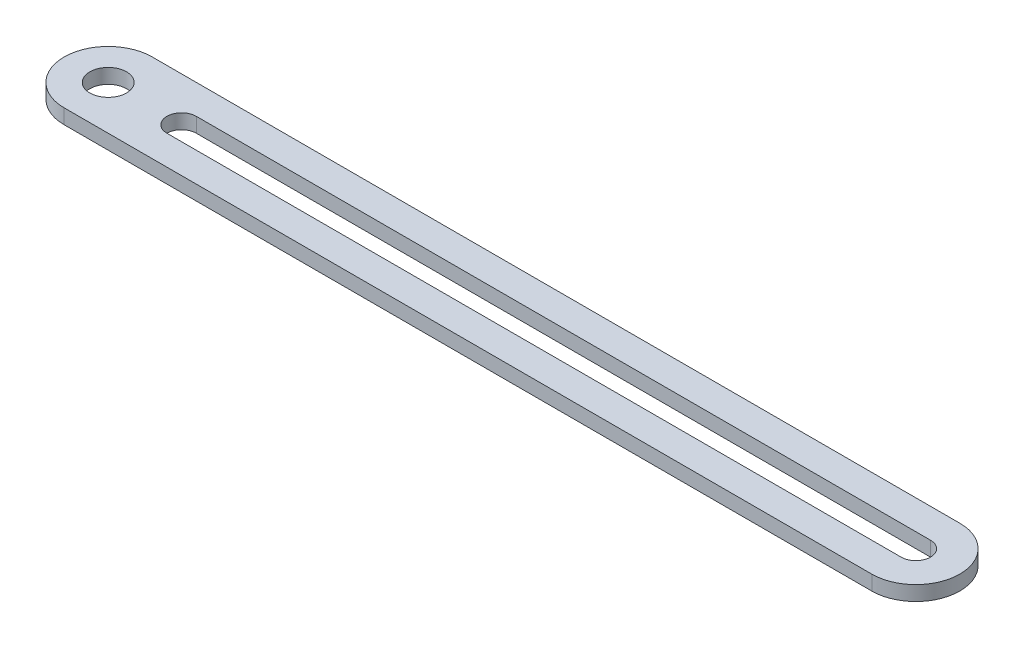
ISO-10303-21;
HEADER;
FILE_DESCRIPTION(('STEP AP214'),'2;1');
FILE_NAME('part.step','',(''),(''),'','','');
FILE_SCHEMA(('AUTOMOTIVE_DESIGN { 1 0 10303 214 1 1 1 1 }'));
ENDSEC;
DATA;
#1=APPLICATION_CONTEXT('core data for automotive mechanical design processes');
#2=APPLICATION_PROTOCOL_DEFINITION('international standard','automotive_design',2000,#1);
#3=PRODUCT_CONTEXT('',#1,'mechanical');
#4=PRODUCT('Part','Part','',(#3));
#5=PRODUCT_RELATED_PRODUCT_CATEGORY('part','',(#4));
#6=PRODUCT_DEFINITION_FORMATION('','',#4);
#7=PRODUCT_DEFINITION_CONTEXT('part definition',#1,'design');
#8=PRODUCT_DEFINITION('design','',#6,#7);
#9=PRODUCT_DEFINITION_SHAPE('','',#8);
#10=(LENGTH_UNIT() NAMED_UNIT(*) SI_UNIT(.MILLI.,.METRE.));
#11=(NAMED_UNIT(*) PLANE_ANGLE_UNIT() SI_UNIT($,.RADIAN.));
#12=(NAMED_UNIT(*) SI_UNIT($,.STERADIAN.) SOLID_ANGLE_UNIT());
#13=UNCERTAINTY_MEASURE_WITH_UNIT(LENGTH_MEASURE(1.E-05),#10,'distance_accuracy_value','');
#14=(GEOMETRIC_REPRESENTATION_CONTEXT(3) GLOBAL_UNCERTAINTY_ASSIGNED_CONTEXT((#13)) GLOBAL_UNIT_ASSIGNED_CONTEXT((#10,
#11,#12)) REPRESENTATION_CONTEXT('',''));
#15=CARTESIAN_POINT('',(0.,0.,0.));
#16=DIRECTION('',(0.,0.,1.));
#17=DIRECTION('',(1.,0.,0.));
#18=AXIS2_PLACEMENT_3D('',#15,#16,#17);
#19=CARTESIAN_POINT('',(0.,2.,0.));
#20=DIRECTION('',(0.,1.,0.));
#21=DIRECTION('',(0.,0.,1.));
#22=AXIS2_PLACEMENT_3D('',#19,#20,#21);
#23=PLANE('',#22);
#24=CARTESIAN_POINT('',(0.,2.,0.));
#25=DIRECTION('',(0.,1.,0.));
#26=DIRECTION('',(0.,0.,1.));
#27=AXIS2_PLACEMENT_3D('',#24,#25,#26);
#28=CIRCLE('',#27,6.);
#29=CARTESIAN_POINT('',(0.,2.,-6.));
#30=VERTEX_POINT('',#29);
#31=CARTESIAN_POINT('',(0.,2.,6.));
#32=VERTEX_POINT('',#31);
#33=EDGE_CURVE('E140',#30,#32,#28,.T.);
#34=ORIENTED_EDGE('',*,*,#33,.T.);
#35=DIRECTION('',(1.,0.,0.));
#36=VECTOR('',#35,1.);
#37=CARTESIAN_POINT('',(0.,2.,6.));
#38=LINE('',#37,#36);
#39=CARTESIAN_POINT('',(110.,2.,6.));
#40=VERTEX_POINT('',#39);
#41=EDGE_CURVE('E143',#32,#40,#38,.T.);
#42=ORIENTED_EDGE('',*,*,#41,.T.);
#43=CARTESIAN_POINT('',(110.,2.,0.));
#44=DIRECTION('',(0.,1.,0.));
#45=DIRECTION('',(0.,0.,1.));
#46=AXIS2_PLACEMENT_3D('',#43,#44,#45);
#47=CIRCLE('',#46,6.);
#48=CARTESIAN_POINT('',(110.,2.,-6.));
#49=VERTEX_POINT('',#48);
#50=EDGE_CURVE('E146',#40,#49,#47,.T.);
#51=ORIENTED_EDGE('',*,*,#50,.T.);
#52=DIRECTION('',(-1.,0.,0.));
#53=VECTOR('',#52,1.);
#54=CARTESIAN_POINT('',(0.,2.,-6.));
#55=LINE('',#54,#53);
#56=EDGE_CURVE('E148',#49,#30,#55,.T.);
#57=ORIENTED_EDGE('',*,*,#56,.T.);
#58=EDGE_LOOP('',(#34,#42,#51,#57));
#59=FACE_BOUND('',#58,.T.);
#60=CARTESIAN_POINT('',(0.,2.,0.));
#61=DIRECTION('',(0.,1.,0.));
#62=DIRECTION('',(0.,0.,1.));
#63=AXIS2_PLACEMENT_3D('',#60,#61,#62);
#64=CIRCLE('',#63,2.5);
#65=CARTESIAN_POINT('',(0.,2.,2.5));
#66=VERTEX_POINT('',#65);
#67=EDGE_CURVE('E134',#66,#66,#64,.T.);
#68=ORIENTED_EDGE('',*,*,#67,.F.);
#69=EDGE_LOOP('',(#68));
#70=FACE_BOUND('',#69,.T.);
#71=DIRECTION('',(1.,0.,0.));
#72=VECTOR('',#71,1.);
#73=CARTESIAN_POINT('',(10.,2.,2.));
#74=LINE('',#73,#72);
#75=CARTESIAN_POINT('',(10.,2.,2.));
#76=VERTEX_POINT('',#75);
#77=CARTESIAN_POINT('',(110.,2.,2.));
#78=VERTEX_POINT('',#77);
#79=EDGE_CURVE('E106',#76,#78,#74,.T.);
#80=ORIENTED_EDGE('',*,*,#79,.F.);
#81=CARTESIAN_POINT('',(10.,2.,0.));
#82=DIRECTION('',(0.,1.,0.));
#83=DIRECTION('',(0.,0.,1.));
#84=AXIS2_PLACEMENT_3D('',#81,#82,#83);
#85=CIRCLE('',#84,2.);
#86=CARTESIAN_POINT('',(10.,2.,-2.));
#87=VERTEX_POINT('',#86);
#88=EDGE_CURVE('E98',#87,#76,#85,.T.);
#89=ORIENTED_EDGE('',*,*,#88,.F.);
#90=DIRECTION('',(-1.,0.,0.));
#91=VECTOR('',#90,1.);
#92=CARTESIAN_POINT('',(10.,2.,-2.));
#93=LINE('',#92,#91);
#94=CARTESIAN_POINT('',(110.,2.,-2.));
#95=VERTEX_POINT('',#94);
#96=EDGE_CURVE('E120',#95,#87,#93,.T.);
#97=ORIENTED_EDGE('',*,*,#96,.F.);
#98=CARTESIAN_POINT('',(110.,2.,0.));
#99=DIRECTION('',(0.,1.,0.));
#100=DIRECTION('',(0.,0.,1.));
#101=AXIS2_PLACEMENT_3D('',#98,#99,#100);
#102=CIRCLE('',#101,2.);
#103=EDGE_CURVE('E118',#78,#95,#102,.T.);
#104=ORIENTED_EDGE('',*,*,#103,.F.);
#105=EDGE_LOOP('',(#80,#89,#97,#104));
#106=FACE_BOUND('',#105,.T.);
#107=ADVANCED_FACE('F33',(#59,#70,#106),#23,.T.);
#108=CARTESIAN_POINT('',(0.,0.,0.));
#109=DIRECTION('',(0.,1.,0.));
#110=DIRECTION('',(0.,0.,1.));
#111=AXIS2_PLACEMENT_3D('',#108,#109,#110);
#112=PLANE('',#111);
#113=CARTESIAN_POINT('',(0.,0.,0.));
#114=DIRECTION('',(0.,1.,0.));
#115=DIRECTION('',(0.,0.,1.));
#116=AXIS2_PLACEMENT_3D('',#113,#114,#115);
#117=CIRCLE('',#116,2.5);
#118=CARTESIAN_POINT('',(0.,0.,2.5));
#119=VERTEX_POINT('',#118);
#120=EDGE_CURVE('E114',#119,#119,#117,.T.);
#121=ORIENTED_EDGE('',*,*,#120,.T.);
#122=EDGE_LOOP('',(#121));
#123=FACE_BOUND('',#122,.T.);
#124=CARTESIAN_POINT('',(0.,0.,0.));
#125=DIRECTION('',(0.,1.,0.));
#126=DIRECTION('',(0.,0.,1.));
#127=AXIS2_PLACEMENT_3D('',#124,#125,#126);
#128=CIRCLE('',#127,6.);
#129=CARTESIAN_POINT('',(0.,0.,-6.));
#130=VERTEX_POINT('',#129);
#131=CARTESIAN_POINT('',(0.,0.,6.));
#132=VERTEX_POINT('',#131);
#133=EDGE_CURVE('E137',#130,#132,#128,.T.);
#134=ORIENTED_EDGE('',*,*,#133,.F.);
#135=DIRECTION('',(-1.,0.,0.));
#136=VECTOR('',#135,1.);
#137=CARTESIAN_POINT('',(0.,0.,-6.));
#138=LINE('',#137,#136);
#139=CARTESIAN_POINT('',(110.,0.,-6.));
#140=VERTEX_POINT('',#139);
#141=EDGE_CURVE('E144',#140,#130,#138,.T.);
#142=ORIENTED_EDGE('',*,*,#141,.F.);
#143=CARTESIAN_POINT('',(110.,0.,0.));
#144=DIRECTION('',(0.,1.,0.));
#145=DIRECTION('',(0.,0.,1.));
#146=AXIS2_PLACEMENT_3D('',#143,#144,#145);
#147=CIRCLE('',#146,6.);
#148=CARTESIAN_POINT('',(110.,0.,6.));
#149=VERTEX_POINT('',#148);
#150=EDGE_CURVE('E155',#149,#140,#147,.T.);
#151=ORIENTED_EDGE('',*,*,#150,.F.);
#152=DIRECTION('',(1.,0.,0.));
#153=VECTOR('',#152,1.);
#154=CARTESIAN_POINT('',(0.,0.,6.));
#155=LINE('',#154,#153);
#156=EDGE_CURVE('E153',#132,#149,#155,.T.);
#157=ORIENTED_EDGE('',*,*,#156,.F.);
#158=EDGE_LOOP('',(#134,#142,#151,#157));
#159=FACE_BOUND('',#158,.T.);
#160=CARTESIAN_POINT('',(10.,0.,0.));
#161=DIRECTION('',(0.,1.,0.));
#162=DIRECTION('',(0.,0.,1.));
#163=AXIS2_PLACEMENT_3D('',#160,#161,#162);
#164=CIRCLE('',#163,2.);
#165=CARTESIAN_POINT('',(10.,0.,-2.));
#166=VERTEX_POINT('',#165);
#167=CARTESIAN_POINT('',(10.,0.,2.));
#168=VERTEX_POINT('',#167);
#169=EDGE_CURVE('E56',#166,#168,#164,.T.);
#170=ORIENTED_EDGE('',*,*,#169,.T.);
#171=DIRECTION('',(1.,0.,0.));
#172=VECTOR('',#171,1.);
#173=CARTESIAN_POINT('',(10.,0.,2.));
#174=LINE('',#173,#172);
#175=CARTESIAN_POINT('',(110.,0.,2.));
#176=VERTEX_POINT('',#175);
#177=EDGE_CURVE('E113',#168,#176,#174,.T.);
#178=ORIENTED_EDGE('',*,*,#177,.T.);
#179=CARTESIAN_POINT('',(110.,0.,0.));
#180=DIRECTION('',(0.,1.,0.));
#181=DIRECTION('',(0.,0.,1.));
#182=AXIS2_PLACEMENT_3D('',#179,#180,#181);
#183=CIRCLE('',#182,2.);
#184=CARTESIAN_POINT('',(110.,0.,-2.));
#185=VERTEX_POINT('',#184);
#186=EDGE_CURVE('E126',#176,#185,#183,.T.);
#187=ORIENTED_EDGE('',*,*,#186,.T.);
#188=DIRECTION('',(-1.,0.,0.));
#189=VECTOR('',#188,1.);
#190=CARTESIAN_POINT('',(10.,0.,-2.));
#191=LINE('',#190,#189);
#192=EDGE_CURVE('E107',#185,#166,#191,.T.);
#193=ORIENTED_EDGE('',*,*,#192,.T.);
#194=EDGE_LOOP('',(#170,#178,#187,#193));
#195=FACE_BOUND('',#194,.T.);
#196=ADVANCED_FACE('F173',(#123,#159,#195),#112,.F.);
#197=CARTESIAN_POINT('',(0.,2.,0.));
#198=DIRECTION('',(0.,-1.,0.));
#199=DIRECTION('',(0.,0.,-1.));
#200=AXIS2_PLACEMENT_3D('',#197,#198,#199);
#201=CYLINDRICAL_SURFACE('',#200,6.);
#202=ORIENTED_EDGE('',*,*,#133,.T.);
#203=DIRECTION('',(0.,-1.,0.));
#204=VECTOR('',#203,1.);
#205=CARTESIAN_POINT('',(0.,2.,6.));
#206=LINE('',#205,#204);
#207=EDGE_CURVE('E11',#32,#132,#206,.T.);
#208=ORIENTED_EDGE('',*,*,#207,.F.);
#209=ORIENTED_EDGE('',*,*,#33,.F.);
#210=DIRECTION('',(0.,-1.,0.));
#211=VECTOR('',#210,1.);
#212=CARTESIAN_POINT('',(0.,2.,-6.));
#213=LINE('',#212,#211);
#214=EDGE_CURVE('E150',#30,#130,#213,.T.);
#215=ORIENTED_EDGE('',*,*,#214,.T.);
#216=EDGE_LOOP('',(#202,#208,#209,#215));
#217=FACE_BOUND('',#216,.T.);
#218=ADVANCED_FACE('F35',(#217),#201,.T.);
#219=CARTESIAN_POINT('',(0.,2.,6.));
#220=DIRECTION('',(0.,0.,-1.));
#221=DIRECTION('',(-1.,0.,0.));
#222=AXIS2_PLACEMENT_3D('',#219,#220,#221);
#223=PLANE('',#222);
#224=ORIENTED_EDGE('',*,*,#156,.T.);
#225=DIRECTION('',(0.,-1.,0.));
#226=VECTOR('',#225,1.);
#227=CARTESIAN_POINT('',(110.,2.,6.));
#228=LINE('',#227,#226);
#229=EDGE_CURVE('E41',#40,#149,#228,.T.);
#230=ORIENTED_EDGE('',*,*,#229,.F.);
#231=ORIENTED_EDGE('',*,*,#41,.F.);
#232=ORIENTED_EDGE('',*,*,#207,.T.);
#233=EDGE_LOOP('',(#224,#230,#231,#232));
#234=FACE_BOUND('',#233,.T.);
#235=ADVANCED_FACE('F184',(#234),#223,.F.);
#236=CARTESIAN_POINT('',(110.,2.,0.));
#237=DIRECTION('',(0.,-1.,0.));
#238=DIRECTION('',(0.,0.,-1.));
#239=AXIS2_PLACEMENT_3D('',#236,#237,#238);
#240=CYLINDRICAL_SURFACE('',#239,6.);
#241=ORIENTED_EDGE('',*,*,#150,.T.);
#242=DIRECTION('',(0.,-1.,0.));
#243=VECTOR('',#242,1.);
#244=CARTESIAN_POINT('',(110.,2.,-6.));
#245=LINE('',#244,#243);
#246=EDGE_CURVE('E160',#49,#140,#245,.T.);
#247=ORIENTED_EDGE('',*,*,#246,.F.);
#248=ORIENTED_EDGE('',*,*,#50,.F.);
#249=ORIENTED_EDGE('',*,*,#229,.T.);
#250=EDGE_LOOP('',(#241,#247,#248,#249));
#251=FACE_BOUND('',#250,.T.);
#252=ADVANCED_FACE('F167',(#251),#240,.T.);
#253=CARTESIAN_POINT('',(0.,2.,-6.));
#254=DIRECTION('',(0.,0.,1.));
#255=DIRECTION('',(1.,0.,0.));
#256=AXIS2_PLACEMENT_3D('',#253,#254,#255);
#257=PLANE('',#256);
#258=ORIENTED_EDGE('',*,*,#141,.T.);
#259=ORIENTED_EDGE('',*,*,#214,.F.);
#260=ORIENTED_EDGE('',*,*,#56,.F.);
#261=ORIENTED_EDGE('',*,*,#246,.T.);
#262=EDGE_LOOP('',(#258,#259,#260,#261));
#263=FACE_BOUND('',#262,.T.);
#264=ADVANCED_FACE('F177',(#263),#257,.F.);
#265=CARTESIAN_POINT('',(0.,2.,0.));
#266=DIRECTION('',(0.,-1.,0.));
#267=DIRECTION('',(0.,0.,-1.));
#268=AXIS2_PLACEMENT_3D('',#265,#266,#267);
#269=CYLINDRICAL_SURFACE('',#268,2.5);
#270=ORIENTED_EDGE('',*,*,#67,.T.);
#271=EDGE_LOOP('',(#270));
#272=FACE_BOUND('',#271,.T.);
#273=ORIENTED_EDGE('',*,*,#120,.F.);
#274=EDGE_LOOP('',(#273));
#275=FACE_BOUND('',#274,.T.);
#276=ADVANCED_FACE('F199',(#272,#275),#269,.F.);
#277=CARTESIAN_POINT('',(10.,2.,0.));
#278=DIRECTION('',(0.,-1.,0.));
#279=DIRECTION('',(0.,0.,-1.));
#280=AXIS2_PLACEMENT_3D('',#277,#278,#279);
#281=CYLINDRICAL_SURFACE('',#280,2.);
#282=ORIENTED_EDGE('',*,*,#169,.F.);
#283=DIRECTION('',(0.,-1.,0.));
#284=VECTOR('',#283,1.);
#285=CARTESIAN_POINT('',(10.,2.,-2.));
#286=LINE('',#285,#284);
#287=EDGE_CURVE('E102',#87,#166,#286,.T.);
#288=ORIENTED_EDGE('',*,*,#287,.F.);
#289=ORIENTED_EDGE('',*,*,#88,.T.);
#290=DIRECTION('',(0.,-1.,0.));
#291=VECTOR('',#290,1.);
#292=CARTESIAN_POINT('',(10.,2.,2.));
#293=LINE('',#292,#291);
#294=EDGE_CURVE('E101',#76,#168,#293,.T.);
#295=ORIENTED_EDGE('',*,*,#294,.T.);
#296=EDGE_LOOP('',(#282,#288,#289,#295));
#297=FACE_BOUND('',#296,.T.);
#298=ADVANCED_FACE('F100',(#297),#281,.F.);
#299=CARTESIAN_POINT('',(10.,2.,2.));
#300=DIRECTION('',(0.,0.,-1.));
#301=DIRECTION('',(-1.,0.,0.));
#302=AXIS2_PLACEMENT_3D('',#299,#300,#301);
#303=PLANE('',#302);
#304=ORIENTED_EDGE('',*,*,#177,.F.);
#305=ORIENTED_EDGE('',*,*,#294,.F.);
#306=ORIENTED_EDGE('',*,*,#79,.T.);
#307=DIRECTION('',(0.,-1.,0.));
#308=VECTOR('',#307,1.);
#309=CARTESIAN_POINT('',(110.,2.,2.));
#310=LINE('',#309,#308);
#311=EDGE_CURVE('E115',#78,#176,#310,.T.);
#312=ORIENTED_EDGE('',*,*,#311,.T.);
#313=EDGE_LOOP('',(#304,#305,#306,#312));
#314=FACE_BOUND('',#313,.T.);
#315=ADVANCED_FACE('F110',(#314),#303,.T.);
#316=CARTESIAN_POINT('',(110.,2.,0.));
#317=DIRECTION('',(0.,-1.,0.));
#318=DIRECTION('',(0.,0.,-1.));
#319=AXIS2_PLACEMENT_3D('',#316,#317,#318);
#320=CYLINDRICAL_SURFACE('',#319,2.);
#321=ORIENTED_EDGE('',*,*,#186,.F.);
#322=ORIENTED_EDGE('',*,*,#311,.F.);
#323=ORIENTED_EDGE('',*,*,#103,.T.);
#324=DIRECTION('',(0.,-1.,0.));
#325=VECTOR('',#324,1.);
#326=CARTESIAN_POINT('',(110.,2.,-2.));
#327=LINE('',#326,#325);
#328=EDGE_CURVE('E48',#95,#185,#327,.T.);
#329=ORIENTED_EDGE('',*,*,#328,.T.);
#330=EDGE_LOOP('',(#321,#322,#323,#329));
#331=FACE_BOUND('',#330,.T.);
#332=ADVANCED_FACE('F216',(#331),#320,.F.);
#333=CARTESIAN_POINT('',(10.,2.,-2.));
#334=DIRECTION('',(0.,0.,1.));
#335=DIRECTION('',(1.,0.,0.));
#336=AXIS2_PLACEMENT_3D('',#333,#334,#335);
#337=PLANE('',#336);
#338=ORIENTED_EDGE('',*,*,#192,.F.);
#339=ORIENTED_EDGE('',*,*,#328,.F.);
#340=ORIENTED_EDGE('',*,*,#96,.T.);
#341=ORIENTED_EDGE('',*,*,#287,.T.);
#342=EDGE_LOOP('',(#338,#339,#340,#341));
#343=FACE_BOUND('',#342,.T.);
#344=ADVANCED_FACE('F221',(#343),#337,.T.);
#345=CLOSED_SHELL('',(#107,#196,#218,#235,#252,#264,#276,#298,#315,#332,#344));
#346=MANIFOLD_SOLID_BREP('B2',#345);
#347=ADVANCED_BREP_SHAPE_REPRESENTATION('',(#18,#346),#14);
#348=SHAPE_DEFINITION_REPRESENTATION(#9,#347);
ENDSEC;
END-ISO-10303-21;
